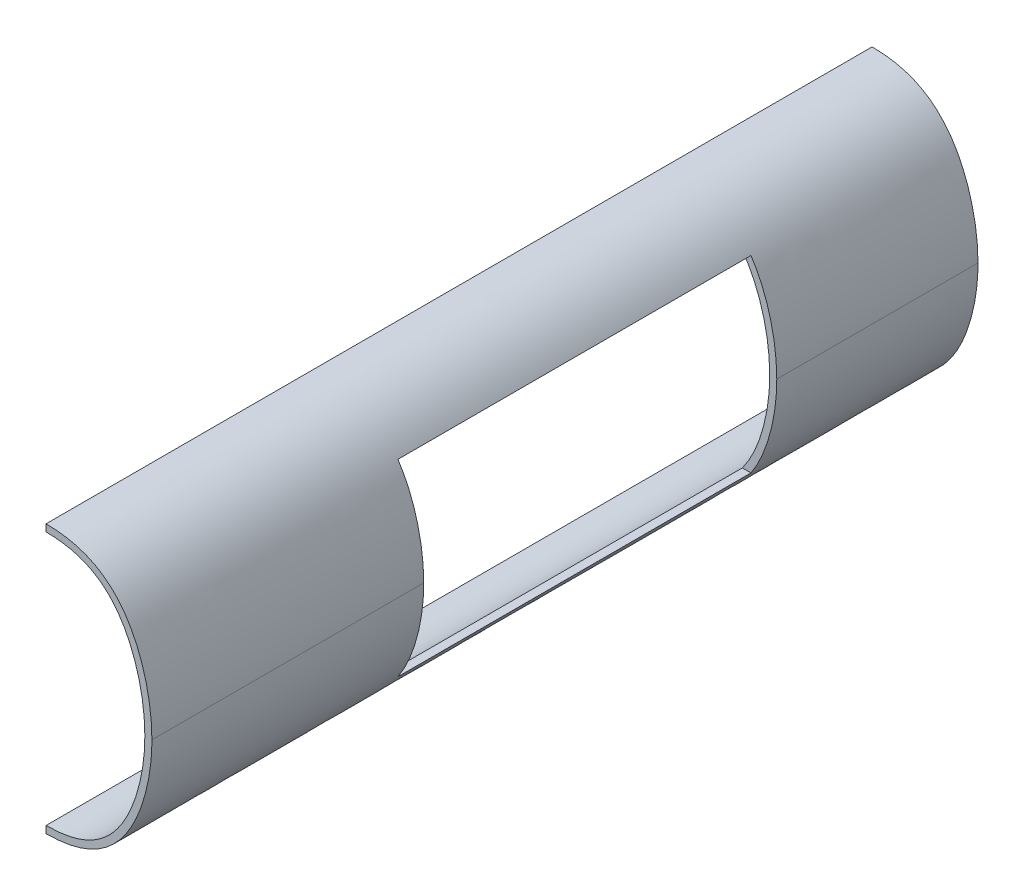
ISO-10303-21;
HEADER;
FILE_DESCRIPTION(('STEP AP214'),'2;1');
FILE_NAME('part.step','',(''),(''),'','','');
FILE_SCHEMA(('AUTOMOTIVE_DESIGN { 1 0 10303 214 1 1 1 1 }'));
ENDSEC;
DATA;
#1=APPLICATION_CONTEXT('core data for automotive mechanical design processes');
#2=APPLICATION_PROTOCOL_DEFINITION('international standard','automotive_design',2000,#1);
#3=PRODUCT_CONTEXT('',#1,'mechanical');
#4=PRODUCT('Part','Part','',(#3));
#5=PRODUCT_RELATED_PRODUCT_CATEGORY('part','',(#4));
#6=PRODUCT_DEFINITION_FORMATION('','',#4);
#7=PRODUCT_DEFINITION_CONTEXT('part definition',#1,'design');
#8=PRODUCT_DEFINITION('design','',#6,#7);
#9=PRODUCT_DEFINITION_SHAPE('','',#8);
#10=(LENGTH_UNIT() NAMED_UNIT(*) SI_UNIT(.MILLI.,.METRE.));
#11=(NAMED_UNIT(*) PLANE_ANGLE_UNIT() SI_UNIT($,.RADIAN.));
#12=(NAMED_UNIT(*) SI_UNIT($,.STERADIAN.) SOLID_ANGLE_UNIT());
#13=UNCERTAINTY_MEASURE_WITH_UNIT(LENGTH_MEASURE(1.E-05),#10,'distance_accuracy_value','');
#14=(GEOMETRIC_REPRESENTATION_CONTEXT(3) GLOBAL_UNCERTAINTY_ASSIGNED_CONTEXT((#13)) GLOBAL_UNIT_ASSIGNED_CONTEXT((#10,
#11,#12)) REPRESENTATION_CONTEXT('',''));
#15=CARTESIAN_POINT('',(0.,0.,0.));
#16=DIRECTION('',(0.,0.,1.));
#17=DIRECTION('',(1.,0.,0.));
#18=AXIS2_PLACEMENT_3D('',#15,#16,#17);
#19=CARTESIAN_POINT('',(129.417258247769,40.,-90.));
#20=DIRECTION('',(0.,0.,-1.));
#21=DIRECTION('',(0.,1.,0.));
#22=AXIS2_PLACEMENT_3D('',#19,#20,#21);
#23=PLANE('',#22);
#24=DIRECTION('',(-1.,0.,0.));
#25=VECTOR('',#24,1.);
#26=CARTESIAN_POINT('',(129.417258247769,40.,-90.));
#27=LINE('',#26,#25);
#28=CARTESIAN_POINT('',(114.03435108866,40.0000000000056,-90.));
#29=VERTEX_POINT('',#28);
#30=CARTESIAN_POINT('',(110.363044156828,40.,-90.));
#31=VERTEX_POINT('',#30);
#32=EDGE_CURVE('E163',#29,#31,#27,.T.);
#33=ORIENTED_EDGE('',*,*,#32,.T.);
#34=CARTESIAN_POINT('',(122.,0.,-90.));
#35=CARTESIAN_POINT('',(122.,3.28869583185754,-90.));
#36=CARTESIAN_POINT('',(121.792444122015,6.46128802269029,-90.));
#37=CARTESIAN_POINT('',(121.033233095635,12.6588725326172,-90.));
#38=CARTESIAN_POINT('',(120.481395371989,15.6836409951729,-90.));
#39=CARTESIAN_POINT('',(119.052306997594,21.5977641807771,-90.));
#40=CARTESIAN_POINT('',(118.174928997309,24.4868468848606,-90.));
#41=CARTESIAN_POINT('',(116.065931680565,30.0772521284996,-90.));
#42=CARTESIAN_POINT('',(114.834227827324,32.7780606729056,-90.));
#43=CARTESIAN_POINT('',(111.943828956462,37.88564685075,-90.));
#44=CARTESIAN_POINT('',(110.285874467775,40.2913945588537,-90.));
#45=CARTESIAN_POINT('',(107.387031345074,43.5765434502416,-90.));
#46=CARTESIAN_POINT('',(106.35165180192,44.6175868515967,-90.));
#47=CARTESIAN_POINT('',(104.118858714764,46.5738644087914,-90.));
#48=CARTESIAN_POINT('',(102.921509381826,47.4891856345442,-90.));
#49=CARTESIAN_POINT('',(100.332473442126,49.1744868527528,-90.));
#50=CARTESIAN_POINT('',(98.9407493786021,49.9446031817335,-90.));
#51=CARTESIAN_POINT('',(95.9213280057517,51.3146447513835,-90.));
#52=CARTESIAN_POINT('',(94.2934859206099,51.9146450933876,-90.));
#53=CARTESIAN_POINT('',(88.983824843489,53.4086746793709,-90.));
#54=CARTESIAN_POINT('',(84.874930893814,54.,-90.));
#55=CARTESIAN_POINT('',(80.,54.,-90.));
#56=B_SPLINE_CURVE_WITH_KNOTS('',3,(#34,#35,#36,#37,#38,#39,#40,#41,#42,#43,#44,#45,#46,#47,#48,
#49,#50,#51,#52,#53,#54,#55),.UNSPECIFIED.,.F.,.F.,(4,2,2,2,2,2,2,2,2,2,4),(0.,0.125,0.25,0.375,
0.5,0.625,0.6875,0.75,0.8125,0.875,1.),.UNSPECIFIED.);
#57=CARTESIAN_POINT('',(122.,0.,-90.));
#58=VERTEX_POINT('',#57);
#59=EDGE_CURVE('E144',#31,#58,#56,.F.);
#60=ORIENTED_EDGE('',*,*,#59,.T.);
#61=CARTESIAN_POINT('',(80.,-54.,-90.));
#62=CARTESIAN_POINT('',(84.8749308938141,-54.,-90.));
#63=CARTESIAN_POINT('',(88.983824843489,-53.4086746793709,-90.));
#64=CARTESIAN_POINT('',(94.2934859206099,-51.9146450933876,-90.));
#65=CARTESIAN_POINT('',(95.9213280057516,-51.3146447513835,-90.));
#66=CARTESIAN_POINT('',(98.9407493786021,-49.9446031817335,-90.));
#67=CARTESIAN_POINT('',(100.332473442126,-49.1744868527527,-90.));
#68=CARTESIAN_POINT('',(102.921509381826,-47.4891856345442,-90.));
#69=CARTESIAN_POINT('',(104.118858714764,-46.5738644087914,-90.));
#70=CARTESIAN_POINT('',(106.35165180192,-44.6175868515967,-90.));
#71=CARTESIAN_POINT('',(107.387031345074,-43.5765434502416,-90.));
#72=CARTESIAN_POINT('',(110.285874467775,-40.2913945588537,-90.));
#73=CARTESIAN_POINT('',(111.943828956462,-37.88564685075,-90.));
#74=CARTESIAN_POINT('',(114.834227827324,-32.7780606729056,-90.));
#75=CARTESIAN_POINT('',(116.065931680565,-30.0772521284996,-90.));
#76=CARTESIAN_POINT('',(118.174928997309,-24.4868468848606,-90.));
#77=CARTESIAN_POINT('',(119.052306997594,-21.5977641807771,-90.));
#78=CARTESIAN_POINT('',(120.481395371989,-15.6836409951729,-90.));
#79=CARTESIAN_POINT('',(121.033233095634,-12.6588725326172,-90.));
#80=CARTESIAN_POINT('',(121.792444122015,-6.46128802269029,-90.));
#81=CARTESIAN_POINT('',(122.,-3.28869583185754,-90.));
#82=CARTESIAN_POINT('',(122.,0.,-90.));
#83=B_SPLINE_CURVE_WITH_KNOTS('',3,(#61,#62,#63,#64,#65,#66,#67,#68,#69,#70,#71,#72,#73,#74,#75,
#76,#77,#78,#79,#80,#81,#82),.UNSPECIFIED.,.F.,.F.,(4,2,2,2,2,2,2,2,2,2,4),(0.,
0.124999999999999,0.187499999999999,0.249999999999999,0.312499999999999,0.374999999999999,0.5,
0.625,0.75,0.875,1.),.UNSPECIFIED.);
#84=CARTESIAN_POINT('',(110.363044156828,-40.,-90.));
#85=VERTEX_POINT('',#84);
#86=EDGE_CURVE('E155',#58,#85,#83,.F.);
#87=ORIENTED_EDGE('',*,*,#86,.T.);
#88=DIRECTION('',(-1.,0.,0.));
#89=VECTOR('',#88,1.);
#90=CARTESIAN_POINT('',(129.417258247769,-40.,-90.));
#91=LINE('',#90,#89);
#92=CARTESIAN_POINT('',(114.03435108866,-40.,-90.));
#93=VERTEX_POINT('',#92);
#94=EDGE_CURVE('E373',#93,#85,#91,.T.);
#95=ORIENTED_EDGE('',*,*,#94,.F.);
#96=CARTESIAN_POINT('',(80.,-57.,-90.));
#97=CARTESIAN_POINT('',(110.715171183919,-57.,-90.));
#98=CARTESIAN_POINT('',(118.023084898436,-36.9930136098683,-90.));
#99=CARTESIAN_POINT('',(125.,-20.4980083685293,-90.));
#100=CARTESIAN_POINT('',(125.,0.,-90.));
#101=B_SPLINE_CURVE_WITH_KNOTS('',4,(#96,#97,#98,#99,#100),.UNSPECIFIED.,.F.,.F.,(5,5),(0.,1.),.UNSPECIFIED.);
#102=CARTESIAN_POINT('',(125.,0.,-90.));
#103=VERTEX_POINT('',#102);
#104=EDGE_CURVE('E73',#93,#103,#101,.T.);
#105=ORIENTED_EDGE('',*,*,#104,.T.);
#106=CARTESIAN_POINT('',(125.,0.,-90.));
#107=CARTESIAN_POINT('',(125.,20.4980083685293,-90.));
#108=CARTESIAN_POINT('',(118.023084898436,36.9930136098683,-90.));
#109=CARTESIAN_POINT('',(110.715171183919,57.,-90.));
#110=CARTESIAN_POINT('',(80.,57.,-90.));
#111=B_SPLINE_CURVE_WITH_KNOTS('',4,(#106,#107,#108,#109,#110),.UNSPECIFIED.,.F.,.F.,(5,5),(0.,
1.),.UNSPECIFIED.);
#112=EDGE_CURVE('E359',#103,#29,#111,.T.);
#113=ORIENTED_EDGE('',*,*,#112,.T.);
#114=EDGE_LOOP('',(#33,#60,#87,#95,#105,#113));
#115=FACE_BOUND('',#114,.T.);
#116=ADVANCED_FACE('F43',(#115),#23,.F.);
#117=CARTESIAN_POINT('',(129.417258247769,-40.,60.));
#118=DIRECTION('',(0.,0.,1.));
#119=DIRECTION('',(0.,-1.,0.));
#120=AXIS2_PLACEMENT_3D('',#117,#118,#119);
#121=PLANE('',#120);
#122=CARTESIAN_POINT('',(80.,-54.,60.));
#123=CARTESIAN_POINT('',(84.8749308938141,-54.,60.));
#124=CARTESIAN_POINT('',(88.983824843489,-53.4086746793709,60.));
#125=CARTESIAN_POINT('',(94.2934859206099,-51.9146450933876,60.));
#126=CARTESIAN_POINT('',(95.9213280057516,-51.3146447513835,60.));
#127=CARTESIAN_POINT('',(98.9407493786021,-49.9446031817335,60.));
#128=CARTESIAN_POINT('',(100.332473442126,-49.1744868527527,60.));
#129=CARTESIAN_POINT('',(102.921509381826,-47.4891856345442,60.));
#130=CARTESIAN_POINT('',(104.118858714764,-46.5738644087914,60.));
#131=CARTESIAN_POINT('',(106.35165180192,-44.6175868515967,60.));
#132=CARTESIAN_POINT('',(107.387031345074,-43.5765434502416,60.));
#133=CARTESIAN_POINT('',(110.285874467775,-40.2913945588537,60.));
#134=CARTESIAN_POINT('',(111.943828956462,-37.88564685075,60.));
#135=CARTESIAN_POINT('',(114.834227827324,-32.7780606729056,60.));
#136=CARTESIAN_POINT('',(116.065931680565,-30.0772521284996,60.));
#137=CARTESIAN_POINT('',(118.174928997309,-24.4868468848606,60.));
#138=CARTESIAN_POINT('',(119.052306997594,-21.5977641807771,60.));
#139=CARTESIAN_POINT('',(120.481395371989,-15.6836409951729,60.));
#140=CARTESIAN_POINT('',(121.033233095634,-12.6588725326172,60.));
#141=CARTESIAN_POINT('',(121.792444122015,-6.46128802269029,60.));
#142=CARTESIAN_POINT('',(122.,-3.28869583185754,60.));
#143=CARTESIAN_POINT('',(122.,0.,60.));
#144=B_SPLINE_CURVE_WITH_KNOTS('',3,(#122,#123,#124,#125,#126,#127,#128,#129,#130,#131,#132,
#133,#134,#135,#136,#137,#138,#139,#140,#141,#142,#143),.UNSPECIFIED.,.F.,.F.,(4,2,2,2,2,2,2,2,
2,2,4),(0.,0.124999999999999,0.187499999999999,0.249999999999999,0.312499999999999,
0.374999999999999,0.5,0.625,0.75,0.875,1.),.UNSPECIFIED.);
#145=CARTESIAN_POINT('',(110.363044156828,-40.,60.));
#146=VERTEX_POINT('',#145);
#147=CARTESIAN_POINT('',(122.,0.,60.));
#148=VERTEX_POINT('',#147);
#149=EDGE_CURVE('E65',#146,#148,#144,.T.);
#150=ORIENTED_EDGE('',*,*,#149,.T.);
#151=CARTESIAN_POINT('',(122.,0.,60.));
#152=CARTESIAN_POINT('',(122.,3.28869583185754,60.));
#153=CARTESIAN_POINT('',(121.792444122015,6.46128802269029,60.));
#154=CARTESIAN_POINT('',(121.033233095635,12.6588725326172,60.));
#155=CARTESIAN_POINT('',(120.481395371989,15.6836409951729,60.));
#156=CARTESIAN_POINT('',(119.052306997594,21.5977641807771,60.));
#157=CARTESIAN_POINT('',(118.174928997309,24.4868468848606,60.));
#158=CARTESIAN_POINT('',(116.065931680565,30.0772521284996,60.));
#159=CARTESIAN_POINT('',(114.834227827324,32.7780606729056,60.));
#160=CARTESIAN_POINT('',(111.943828956462,37.88564685075,60.));
#161=CARTESIAN_POINT('',(110.285874467775,40.2913945588537,60.));
#162=CARTESIAN_POINT('',(107.387031345074,43.5765434502416,60.));
#163=CARTESIAN_POINT('',(106.35165180192,44.6175868515967,60.));
#164=CARTESIAN_POINT('',(104.118858714764,46.5738644087914,60.));
#165=CARTESIAN_POINT('',(102.921509381826,47.4891856345442,60.));
#166=CARTESIAN_POINT('',(100.332473442126,49.1744868527528,60.));
#167=CARTESIAN_POINT('',(98.9407493786021,49.9446031817335,60.));
#168=CARTESIAN_POINT('',(95.9213280057517,51.3146447513835,60.));
#169=CARTESIAN_POINT('',(94.2934859206099,51.9146450933876,60.));
#170=CARTESIAN_POINT('',(88.983824843489,53.4086746793709,60.));
#171=CARTESIAN_POINT('',(84.874930893814,54.,60.));
#172=CARTESIAN_POINT('',(80.,54.,60.));
#173=B_SPLINE_CURVE_WITH_KNOTS('',3,(#151,#152,#153,#154,#155,#156,#157,#158,#159,#160,#161,
#162,#163,#164,#165,#166,#167,#168,#169,#170,#171,#172),.UNSPECIFIED.,.F.,.F.,(4,2,2,2,2,2,2,2,
2,2,4),(0.,0.125,0.25,0.375,0.5,0.625,0.6875,0.75,0.8125,0.875,1.),.UNSPECIFIED.);
#174=CARTESIAN_POINT('',(110.363044156828,40.,60.));
#175=VERTEX_POINT('',#174);
#176=EDGE_CURVE('E166',#148,#175,#173,.T.);
#177=ORIENTED_EDGE('',*,*,#176,.T.);
#178=DIRECTION('',(-1.,0.,0.));
#179=VECTOR('',#178,1.);
#180=CARTESIAN_POINT('',(129.417258247769,40.,60.));
#181=LINE('',#180,#179);
#182=CARTESIAN_POINT('',(114.03435108866,40.,60.));
#183=VERTEX_POINT('',#182);
#184=EDGE_CURVE('E367',#183,#175,#181,.T.);
#185=ORIENTED_EDGE('',*,*,#184,.F.);
#186=CARTESIAN_POINT('',(125.,0.,60.));
#187=CARTESIAN_POINT('',(125.,20.4980083685293,60.));
#188=CARTESIAN_POINT('',(118.023084898436,36.9930136098683,60.));
#189=CARTESIAN_POINT('',(110.715171183919,57.,60.));
#190=CARTESIAN_POINT('',(80.,57.,60.));
#191=B_SPLINE_CURVE_WITH_KNOTS('',4,(#186,#187,#188,#189,#190),.UNSPECIFIED.,.F.,.F.,(5,5),(0.,
1.),.UNSPECIFIED.);
#192=CARTESIAN_POINT('',(125.,0.,60.));
#193=VERTEX_POINT('',#192);
#194=EDGE_CURVE('E396',#183,#193,#191,.F.);
#195=ORIENTED_EDGE('',*,*,#194,.T.);
#196=CARTESIAN_POINT('',(80.,-57.,60.));
#197=CARTESIAN_POINT('',(110.715171183919,-57.,60.));
#198=CARTESIAN_POINT('',(118.023084898436,-36.9930136098683,60.));
#199=CARTESIAN_POINT('',(125.,-20.4980083685293,60.));
#200=CARTESIAN_POINT('',(125.,0.,60.));
#201=B_SPLINE_CURVE_WITH_KNOTS('',4,(#196,#197,#198,#199,#200),.UNSPECIFIED.,.F.,.F.,(5,5),(0.,
1.),.UNSPECIFIED.);
#202=CARTESIAN_POINT('',(114.034351088664,-40.,60.));
#203=VERTEX_POINT('',#202);
#204=EDGE_CURVE('E374',#193,#203,#201,.F.);
#205=ORIENTED_EDGE('',*,*,#204,.T.);
#206=DIRECTION('',(-1.,0.,0.));
#207=VECTOR('',#206,1.);
#208=CARTESIAN_POINT('',(129.417258247769,-40.,60.));
#209=LINE('',#208,#207);
#210=EDGE_CURVE('E377',#203,#146,#209,.T.);
#211=ORIENTED_EDGE('',*,*,#210,.T.);
#212=EDGE_LOOP('',(#150,#177,#185,#195,#205,#211));
#213=FACE_BOUND('',#212,.T.);
#214=ADVANCED_FACE('F216',(#213),#121,.F.);
#215=CARTESIAN_POINT('',(129.417258247769,40.,60.));
#216=DIRECTION('',(0.,1.,0.));
#217=DIRECTION('',(0.,0.,1.));
#218=AXIS2_PLACEMENT_3D('',#215,#216,#217);
#219=PLANE('',#218);
#220=ORIENTED_EDGE('',*,*,#184,.T.);
#221=DIRECTION('',(0.,0.,1.));
#222=VECTOR('',#221,1.);
#223=CARTESIAN_POINT('',(110.363044156828,40.,15.7170566811359));
#224=LINE('',#223,#222);
#225=EDGE_CURVE('E160',#175,#31,#224,.F.);
#226=ORIENTED_EDGE('',*,*,#225,.T.);
#227=ORIENTED_EDGE('',*,*,#32,.F.);
#228=DIRECTION('',(0.,0.,-1.));
#229=VECTOR('',#228,1.);
#230=CARTESIAN_POINT('',(114.034351088664,40.,140.));
#231=LINE('',#230,#229);
#232=EDGE_CURVE('E401',#29,#183,#231,.F.);
#233=ORIENTED_EDGE('',*,*,#232,.T.);
#234=EDGE_LOOP('',(#220,#226,#227,#233));
#235=FACE_BOUND('',#234,.T.);
#236=ADVANCED_FACE('F273',(#235),#219,.F.);
#237=CARTESIAN_POINT('',(125.,0.,140.));
#238=CARTESIAN_POINT('',(125.,20.4980083685293,140.));
#239=CARTESIAN_POINT('',(118.023084898436,36.9930136098683,140.));
#240=CARTESIAN_POINT('',(110.715171183919,57.,140.));
#241=CARTESIAN_POINT('',(80.,57.,140.));
#242=B_SPLINE_CURVE_WITH_KNOTS('',4,(#237,#238,#239,#240,#241),.UNSPECIFIED.,.F.,.F.,(5,5),(0.,
1.),.UNSPECIFIED.);
#243=DIRECTION('',(0.,0.,-1.));
#244=VECTOR('',#243,1.);
#245=SURFACE_OF_LINEAR_EXTRUSION('',#242,#244);
#246=ORIENTED_EDGE('',*,*,#194,.F.);
#247=ORIENTED_EDGE('',*,*,#232,.F.);
#248=ORIENTED_EDGE('',*,*,#112,.F.);
#249=DIRECTION('',(0.,0.,-1.));
#250=VECTOR('',#249,1.);
#251=CARTESIAN_POINT('',(125.,0.,140.));
#252=LINE('',#251,#250);
#253=CARTESIAN_POINT('',(125.,0.,-175.5));
#254=VERTEX_POINT('',#253);
#255=EDGE_CURVE('E314',#103,#254,#252,.T.);
#256=ORIENTED_EDGE('',*,*,#255,.T.);
#257=CARTESIAN_POINT('',(125.,0.,-175.5));
#258=CARTESIAN_POINT('',(125.,20.4980083685293,-175.5));
#259=CARTESIAN_POINT('',(118.023084898436,36.9930136098683,-175.5));
#260=CARTESIAN_POINT('',(110.715171183919,57.,-175.5));
#261=CARTESIAN_POINT('',(80.,57.,-175.5));
#262=B_SPLINE_CURVE_WITH_KNOTS('',4,(#257,#258,#259,#260,#261),.UNSPECIFIED.,.F.,.F.,(5,5),(0.,
1.),.UNSPECIFIED.);
#263=CARTESIAN_POINT('',(80.,57.,-175.5));
#264=VERTEX_POINT('',#263);
#265=EDGE_CURVE('E248',#254,#264,#262,.T.);
#266=ORIENTED_EDGE('',*,*,#265,.T.);
#267=DIRECTION('',(0.,0.,-1.));
#268=VECTOR('',#267,1.);
#269=CARTESIAN_POINT('',(80.,57.,140.));
#270=LINE('',#269,#268);
#271=CARTESIAN_POINT('',(80.,57.,175.5));
#272=VERTEX_POINT('',#271);
#273=EDGE_CURVE('E315',#272,#264,#270,.T.);
#274=ORIENTED_EDGE('',*,*,#273,.F.);
#275=CARTESIAN_POINT('',(125.,0.,175.5));
#276=CARTESIAN_POINT('',(125.000021905957,0.88412495725523,175.5));
#277=CARTESIAN_POINT('',(124.985396659929,1.76823988011449,175.5));
#278=CARTESIAN_POINT('',(124.927153725745,3.53610800996547,175.5));
#279=CARTESIAN_POINT('',(124.883516647795,4.4198605792527,175.5));
#280=CARTESIAN_POINT('',(124.767521915685,6.18594603403943,175.5));
#281=CARTESIAN_POINT('',(124.695149010556,7.06827791546259,175.5));
#282=CARTESIAN_POINT('',(124.522051194296,8.83047930563684,175.5));
#283=CARTESIAN_POINT('',(124.421315919242,9.71034779531907,175.5));
#284=CARTESIAN_POINT('',(124.191840615575,11.4665774637001,175.5));
#285=CARTESIAN_POINT('',(124.063095742492,12.3429380089378,175.5));
#286=CARTESIAN_POINT('',(123.775801017414,14.1037238194357,175.5));
#287=CARTESIAN_POINT('',(123.616848556384,14.9880834195816,175.5));
#288=CARTESIAN_POINT('',(123.270463816436,16.751116940104,175.5));
#289=CARTESIAN_POINT('',(123.083034405673,17.6297914237947,175.5));
#290=CARTESIAN_POINT('',(122.679522563988,19.3803445072033,175.5));
#291=CARTESIAN_POINT('',(122.463446322599,20.2522245319912,175.5));
#292=CARTESIAN_POINT('',(122.00215504294,21.987995860548,175.5));
#293=CARTESIAN_POINT('',(121.756947939606,22.8518892709965,175.5));
#294=CARTESIAN_POINT('',(121.236532873307,24.5704252174842,175.5));
#295=CARTESIAN_POINT('',(120.961331218873,25.4250696573818,175.5));
#296=CARTESIAN_POINT('',(120.452294707547,26.9115349975291,175.5));
#297=CARTESIAN_POINT('',(120.225292345231,27.5457015435355,175.5));
#298=CARTESIAN_POINT('',(119.75305317457,28.8071229521,175.5));
#299=CARTESIAN_POINT('',(119.507818943831,29.4343787773469,175.5));
#300=CARTESIAN_POINT('',(118.998344975042,30.6810854913774,175.5));
#301=CARTESIAN_POINT('',(118.734106516961,31.3005369025057,175.5));
#302=CARTESIAN_POINT('',(118.185702609543,32.5306910474586,175.5));
#303=CARTESIAN_POINT('',(117.90153395468,33.1413923548264,175.5));
#304=CARTESIAN_POINT('',(117.313229846686,34.3509068045039,175.5));
#305=CARTESIAN_POINT('',(117.009155341077,34.9497495383415,175.5));
#306=CARTESIAN_POINT('',(116.379291347667,36.1359809229719,175.5));
#307=CARTESIAN_POINT('',(116.053500317411,36.7233687563222,175.5));
#308=CARTESIAN_POINT('',(115.379279480129,37.8849016102102,175.5));
#309=CARTESIAN_POINT('',(115.030853438759,38.4590488120903,175.5));
#310=CARTESIAN_POINT('',(114.310390053749,39.592277664032,175.5));
#311=CARTESIAN_POINT('',(113.938355131017,40.1513608504427,175.5));
#312=CARTESIAN_POINT('',(113.152408320626,41.2773294961636,175.5));
#313=CARTESIAN_POINT('',(112.737363906449,41.843426579539,175.5));
#314=CARTESIAN_POINT('',(111.879742484711,42.9543338139712,175.5));
#315=CARTESIAN_POINT('',(111.437167777736,43.4991457375584,175.5));
#316=CARTESIAN_POINT('',(110.523973904608,44.5647633733149,175.5));
#317=CARTESIAN_POINT('',(110.053355404172,45.0855696548222,175.5));
#318=CARTESIAN_POINT('',(109.085326142833,46.0989354165096,175.5));
#319=CARTESIAN_POINT('',(108.587993544078,46.5915694344624,175.5));
#320=CARTESIAN_POINT('',(107.565710958554,47.5474009012903,175.5));
#321=CARTESIAN_POINT('',(107.040759429389,48.0105967029718,175.5));
#322=CARTESIAN_POINT('',(105.964228354557,48.9049063431717,175.5));
#323=CARTESIAN_POINT('',(105.412650317002,49.3360219951859,175.5));
#324=CARTESIAN_POINT('',(104.282182238455,50.1655236867964,175.5));
#325=CARTESIAN_POINT('',(103.703196878404,50.5637799093767,175.5));
#326=CARTESIAN_POINT('',(102.521808687751,51.3239994677627,175.5));
#327=CARTESIAN_POINT('',(101.919404113041,51.6859600932992,175.5));
#328=CARTESIAN_POINT('',(100.693643642394,52.3723857826608,175.5));
#329=CARTESIAN_POINT('',(100.070288609451,52.6968523885042,175.5));
#330=CARTESIAN_POINT('',(98.8019766290414,53.3094060214475,175.5));
#331=CARTESIAN_POINT('',(98.1569242861535,53.597295308866,175.5));
#332=CARTESIAN_POINT('',(96.8511130820279,54.1348887912943,175.5));
#333=CARTESIAN_POINT('',(96.1903537615974,54.3845918683417,175.5));
#334=CARTESIAN_POINT('',(94.8559749373416,54.846554996168,175.5));
#335=CARTESIAN_POINT('',(94.1823568108767,55.058819032534,175.5));
#336=CARTESIAN_POINT('',(92.9536295290234,55.4103525432984,175.5));
#337=CARTESIAN_POINT('',(92.4002811862601,55.5558304738694,175.5));
#338=CARTESIAN_POINT('',(91.2880661692533,55.8239223329893,175.5));
#339=CARTESIAN_POINT('',(90.7291993775877,55.946535773916,175.5));
#340=CARTESIAN_POINT('',(89.6069509337732,56.1698908286375,175.5));
#341=CARTESIAN_POINT('',(89.0435679360075,56.2706256518717,175.5));
#342=CARTESIAN_POINT('',(87.9132782562355,56.4512502477082,175.5));
#343=CARTESIAN_POINT('',(87.3463703902539,56.5311325803773,175.5));
#344=CARTESIAN_POINT('',(86.2157673562683,56.6703915443754,175.5));
#345=CARTESIAN_POINT('',(85.6520961329945,56.7299637956756,175.5));
#346=CARTESIAN_POINT('',(84.5232507890276,56.8307354886724,175.5));
#347=CARTESIAN_POINT('',(83.9580770303026,56.8719390118989,175.5));
#348=CARTESIAN_POINT('',(82.8272014732656,56.9370145697491,175.5));
#349=CARTESIAN_POINT('',(82.2615004601285,56.9609004556315,175.5));
#350=CARTESIAN_POINT('',(81.1305219729804,56.9923769822036,175.5));
#351=CARTESIAN_POINT('',(80.5652452110013,56.9999929376814,175.5));
#352=CARTESIAN_POINT('',(80.,57.,175.5));
#353=B_SPLINE_CURVE_WITH_KNOTS('',3,(#275,#276,#277,#278,#279,#280,#281,#282,#283,#284,#285,
#286,#287,#288,#289,#290,#291,#292,#293,#294,#295,#296,#297,#298,#299,#300,#301,#302,#303,#304,
#305,#306,#307,#308,#309,#310,#311,#312,#313,#314,#315,#316,#317,#318,#319,#320,#321,#322,#323,
#324,#325,#326,#327,#328,#329,#330,#331,#332,#333,#334,#335,#336,#337,#338,#339,#340,#341,#342,
#343,#344,#345,#346,#347,#348,#349,#350,#351,#352),.UNSPECIFIED.,.F.,.F.,(4,2,2,2,2,2,2,2,2,2,2,
2,2,2,2,2,2,2,2,2,2,2,2,2,2,2,2,2,2,2,2,2,2,2,2,2,2,2,4),(0.,2.65223864943779,5.30625168296547,
7.96167516823353,10.6180702367655,13.2749251143878,15.9700502958243,18.6649042082795,
21.359176807443,24.0527171909762,26.7456921514531,28.7661489704064,30.7863206801265,
32.8063564549349,34.8267178760649,36.8411591485508,38.8557436530273,40.8699938566751,
42.8840378473356,44.9890604975232,47.0939074758028,49.1987045080554,51.2976471603932,
53.3967071543018,55.4956483977422,57.6025200888406,59.709548987548,61.8164911995212,
63.9343785022772,66.0523277977112,68.1700514897977,69.886026281633,71.6020376652233,
73.3185808959264,75.0357357353617,76.7358505589301,78.4355874285956,80.1339632842798,
81.8296946644076),.UNSPECIFIED.);
#354=CARTESIAN_POINT('',(125.,0.,175.5));
#355=VERTEX_POINT('',#354);
#356=EDGE_CURVE('E318',#355,#272,#353,.T.);
#357=ORIENTED_EDGE('',*,*,#356,.F.);
#358=EDGE_CURVE('E57',#355,#193,#252,.T.);
#359=ORIENTED_EDGE('',*,*,#358,.T.);
#360=EDGE_LOOP('',(#246,#247,#248,#256,#266,#274,#357,#359));
#361=FACE_BOUND('',#360,.T.);
#362=ADVANCED_FACE('F329',(#361),#245,.F.);
#363=CARTESIAN_POINT('',(80.,-57.,140.));
#364=CARTESIAN_POINT('',(110.715171183919,-57.,140.));
#365=CARTESIAN_POINT('',(118.023084898436,-36.9930136098683,140.));
#366=CARTESIAN_POINT('',(125.,-20.4980083685293,140.));
#367=CARTESIAN_POINT('',(125.,0.,140.));
#368=B_SPLINE_CURVE_WITH_KNOTS('',4,(#363,#364,#365,#366,#367),.UNSPECIFIED.,.F.,.F.,(5,5),(0.,
1.),.UNSPECIFIED.);
#369=DIRECTION('',(0.,0.,-1.));
#370=VECTOR('',#369,1.);
#371=SURFACE_OF_LINEAR_EXTRUSION('',#368,#370);
#372=DIRECTION('',(0.,0.,-1.));
#373=VECTOR('',#372,1.);
#374=CARTESIAN_POINT('',(114.034351088664,-40.,140.));
#375=LINE('',#374,#373);
#376=EDGE_CURVE('E389',#203,#93,#375,.T.);
#377=ORIENTED_EDGE('',*,*,#376,.F.);
#378=ORIENTED_EDGE('',*,*,#204,.F.);
#379=ORIENTED_EDGE('',*,*,#358,.F.);
#380=CARTESIAN_POINT('',(80.,-57.,175.5));
#381=CARTESIAN_POINT('',(80.5755602355101,-56.999992440315,175.5));
#382=CARTESIAN_POINT('',(81.1511544604504,-56.9920962045595,175.5));
#383=CARTESIAN_POINT('',(82.3027707163957,-56.9594414887975,175.5));
#384=CARTESIAN_POINT('',(82.8787919832119,-56.934656347354,175.5));
#385=CARTESIAN_POINT('',(84.0302589728295,-56.8671051108776,175.5));
#386=CARTESIAN_POINT('',(84.6057038630692,-56.824324605364,175.5));
#387=CARTESIAN_POINT('',(85.7549886351698,-56.7196621923181,175.5));
#388=CARTESIAN_POINT('',(86.3288281507797,-56.6577762359066,175.5));
#389=CARTESIAN_POINT('',(87.4802380038372,-56.5130016340427,175.5));
#390=CARTESIAN_POINT('',(88.0577805895753,-56.429890876115,175.5));
#391=CARTESIAN_POINT('',(89.2091189838251,-56.2418997181837,175.5));
#392=CARTESIAN_POINT('',(89.7829160398802,-56.1370269929438,175.5));
#393=CARTESIAN_POINT('',(90.9257124340834,-55.9044297264416,175.5));
#394=CARTESIAN_POINT('',(91.4947130517793,-55.7767114956028,175.5));
#395=CARTESIAN_POINT('',(92.6268724159215,-55.4973844391691,175.5));
#396=CARTESIAN_POINT('',(93.1900308194494,-55.3457742195572,175.5));
#397=CARTESIAN_POINT('',(94.3152646118441,-55.0159810576199,175.5));
#398=CARTESIAN_POINT('',(94.8772599128702,-54.8375241041102,175.5));
#399=CARTESIAN_POINT('',(95.992443305179,-54.4545267205077,175.5));
#400=CARTESIAN_POINT('',(96.5456294874765,-54.2499807210203,175.5));
#401=CARTESIAN_POINT('',(97.6414570879943,-53.8143491685895,175.5));
#402=CARTESIAN_POINT('',(98.1840986806204,-53.5832640550364,175.5));
#403=CARTESIAN_POINT('',(99.2571970426202,-53.0943497725944,175.5));
#404=CARTESIAN_POINT('',(99.7876540681582,-52.8365211665816,175.5));
#405=CARTESIAN_POINT('',(100.831565837115,-52.2958913464075,175.5));
#406=CARTESIAN_POINT('',(101.345104974294,-52.0132531780993,175.5));
#407=CARTESIAN_POINT('',(102.357111558487,-51.4220722581378,175.5));
#408=CARTESIAN_POINT('',(102.855577764427,-51.1135273812359,175.5));
#409=CARTESIAN_POINT('',(103.836017298633,-50.4713228034252,175.5));
#410=CARTESIAN_POINT('',(104.317991526241,-50.1376644751904,175.5));
#411=CARTESIAN_POINT('',(105.264238544751,-49.4463240706627,175.5));
#412=CARTESIAN_POINT('',(105.72851502134,-49.088647039767,175.5));
#413=CARTESIAN_POINT('',(106.570830890492,-48.405442295238,175.5));
#414=CARTESIAN_POINT('',(106.951421695139,-48.0830515584701,175.5));
#415=CARTESIAN_POINT('',(107.698834237263,-47.422628466892,175.5));
#416=CARTESIAN_POINT('',(108.065654841856,-47.0845948302158,175.5));
#417=CARTESIAN_POINT('',(108.785145416746,-46.3939542863389,175.5));
#418=CARTESIAN_POINT('',(109.137818574512,-46.041350698557,175.5));
#419=CARTESIAN_POINT('',(109.828992356071,-45.3224959956747,175.5));
#420=CARTESIAN_POINT('',(110.167491684014,-44.9562436384882,175.5));
#421=CARTESIAN_POINT('',(111.163493457125,-43.8365054639208,175.5));
#422=CARTESIAN_POINT('',(111.799618712152,-43.0638537545772,175.5));
#423=CARTESIAN_POINT('',(113.01594369353,-41.4758191722722,175.5));
#424=CARTESIAN_POINT('',(113.596134404426,-40.6604294434389,175.5));
#425=CARTESIAN_POINT('',(114.594082419832,-39.1583342016911,175.5));
#426=CARTESIAN_POINT('',(115.02133223914,-38.4778939448455,175.5));
#427=CARTESIAN_POINT('',(115.8431188209,-37.097263745601,175.5));
#428=CARTESIAN_POINT('',(116.23764461636,-36.3970672867084,175.5));
#429=CARTESIAN_POINT('',(116.995666255407,-34.9797774441466,175.5));
#430=CARTESIAN_POINT('',(117.359150034975,-34.2626776281448,175.5));
#431=CARTESIAN_POINT('',(118.056605509507,-32.8143113923982,175.5));
#432=CARTESIAN_POINT('',(118.390577504304,-32.0830451166729,175.5));
#433=CARTESIAN_POINT('',(119.031778307436,-30.6056782819398,175.5));
#434=CARTESIAN_POINT('',(119.338903111505,-29.8595326917541,175.5));
#435=CARTESIAN_POINT('',(119.926338735485,-28.3570481599689,175.5));
#436=CARTESIAN_POINT('',(120.206657800211,-27.6007124348025,175.5));
#437=CARTESIAN_POINT('',(120.741782209611,-26.0791101096768,175.5));
#438=CARTESIAN_POINT('',(120.996588273017,-25.3138437619819,175.5));
#439=CARTESIAN_POINT('',(121.481679303024,-23.7755324529587,175.5));
#440=CARTESIAN_POINT('',(121.711962614388,-23.0024869704038,175.5));
#441=CARTESIAN_POINT('',(122.134842345478,-21.4990219163246,175.5));
#442=CARTESIAN_POINT('',(122.328903418374,-20.7690133404529,175.5));
#443=CARTESIAN_POINT('',(122.69655503518,-19.3038377482415,175.5));
#444=CARTESIAN_POINT('',(122.870144931548,-18.5686705695045,175.5));
#445=CARTESIAN_POINT('',(123.197097946696,-17.09381694963,175.5));
#446=CARTESIAN_POINT('',(123.350460058286,-16.354130285374,175.5));
#447=CARTESIAN_POINT('',(123.637043950677,-14.8708420805634,175.5));
#448=CARTESIAN_POINT('',(123.770265083349,-14.1272404148222,175.5));
#449=CARTESIAN_POINT('',(124.016524874472,-12.6367009586727,175.5));
#450=CARTESIAN_POINT('',(124.129563496203,-11.8897631621973,175.5));
#451=CARTESIAN_POINT('',(124.333935211382,-10.4031704727705,175.5));
#452=CARTESIAN_POINT('',(124.425540074519,-9.6635529395536,175.5));
#453=CARTESIAN_POINT('',(124.588771333516,-8.18214966423865,175.5));
#454=CARTESIAN_POINT('',(124.66039865963,-7.44036402472445,175.5));
#455=CARTESIAN_POINT('',(124.783446333957,-5.95517473660012,175.5));
#456=CARTESIAN_POINT('',(124.834868240537,-5.21177121721964,175.5));
#457=CARTESIAN_POINT('',(124.917276623345,-3.72389602543719,175.5));
#458=CARTESIAN_POINT('',(124.948264903992,-2.97942445317111,175.5));
#459=CARTESIAN_POINT('',(124.98963175673,-1.48997015018992,175.5));
#460=CARTESIAN_POINT('',(125.000012000912,-0.744987465852309,175.5));
#461=CARTESIAN_POINT('',(125.,0.,175.5));
#462=B_SPLINE_CURVE_WITH_KNOTS('',3,(#380,#381,#382,#383,#384,#385,#386,#387,#388,#389,#390,
#391,#392,#393,#394,#395,#396,#397,#398,#399,#400,#401,#402,#403,#404,#405,#406,#407,#408,#409,
#410,#411,#412,#413,#414,#415,#416,#417,#418,#419,#420,#421,#422,#423,#424,#425,#426,#427,#428,
#429,#430,#431,#432,#433,#434,#435,#436,#437,#438,#439,#440,#441,#442,#443,#444,#445,#446,#447,
#448,#449,#450,#451,#452,#453,#454,#455,#456,#457,#458,#459,#460,#461),.UNSPECIFIED.,.F.,.F.,(4,
2,2,2,2,2,2,2,2,2,2,2,2,2,2,2,2,2,2,2,2,2,2,2,2,2,2,2,2,2,2,2,2,2,2,2,2,2,2,2,4),(0.,
1.72667724663164,3.45608662262622,5.18688353417695,6.91804749300693,8.66812834150694,
10.4175930371303,12.1665752368644,13.9156595216186,15.683987954056,17.4526945166178,
19.2213718001066,20.9900118654093,22.7477928575966,24.5057181899296,26.2635475056501,
28.0210087177988,29.5169286982239,31.0129714804452,32.5086752839095,34.0045155356669,
37.004016817017,40.0040007485445,42.4134307435608,44.8236649894484,47.2348317145728,
49.6459739400854,52.0660771977577,54.4854336782375,56.9047219834766,59.3241734825274,
61.5899624484026,63.8558230661771,66.1217964639403,68.3878427643045,70.6538931873688,
72.8894313194716,75.1248653362387,77.3601269085542,79.5951910667702,81.8300738693715),.UNSPECIFIED.);
#463=CARTESIAN_POINT('',(80.,-57.,175.5));
#464=VERTEX_POINT('',#463);
#465=EDGE_CURVE('E247',#464,#355,#462,.T.);
#466=ORIENTED_EDGE('',*,*,#465,.F.);
#467=DIRECTION('',(0.,0.,-1.));
#468=VECTOR('',#467,1.);
#469=CARTESIAN_POINT('',(80.,-57.,140.));
#470=LINE('',#469,#468);
#471=CARTESIAN_POINT('',(80.,-57.,-175.5));
#472=VERTEX_POINT('',#471);
#473=EDGE_CURVE('E11',#464,#472,#470,.T.);
#474=ORIENTED_EDGE('',*,*,#473,.T.);
#475=CARTESIAN_POINT('',(80.,-57.,-175.5));
#476=CARTESIAN_POINT('',(110.715171183919,-57.,-175.5));
#477=CARTESIAN_POINT('',(118.023084898436,-36.9930136098683,-175.5));
#478=CARTESIAN_POINT('',(125.,-20.4980083685293,-175.5));
#479=CARTESIAN_POINT('',(125.,0.,-175.5));
#480=B_SPLINE_CURVE_WITH_KNOTS('',4,(#475,#476,#477,#478,#479),.UNSPECIFIED.,.F.,.F.,(5,5),(0.,
1.),.UNSPECIFIED.);
#481=EDGE_CURVE('E240',#472,#254,#480,.T.);
#482=ORIENTED_EDGE('',*,*,#481,.T.);
#483=ORIENTED_EDGE('',*,*,#255,.F.);
#484=ORIENTED_EDGE('',*,*,#104,.F.);
#485=EDGE_LOOP('',(#377,#378,#379,#466,#474,#482,#483,#484));
#486=FACE_BOUND('',#485,.T.);
#487=ADVANCED_FACE('F45',(#486),#371,.F.);
#488=CARTESIAN_POINT('',(115.999949632893,-36.809382195833,175.5));
#489=DIRECTION('',(0.,0.,-1.));
#490=DIRECTION('',(-1.,0.,0.));
#491=AXIS2_PLACEMENT_3D('',#488,#489,#490);
#492=PLANE('',#491);
#493=CARTESIAN_POINT('',(80.,-54.,175.5));
#494=CARTESIAN_POINT('',(84.8749308938141,-54.,175.5));
#495=CARTESIAN_POINT('',(88.983824843489,-53.4086746793709,175.5));
#496=CARTESIAN_POINT('',(94.2934859206099,-51.9146450933876,175.5));
#497=CARTESIAN_POINT('',(95.9213280057516,-51.3146447513835,175.5));
#498=CARTESIAN_POINT('',(98.9407493786021,-49.9446031817335,175.5));
#499=CARTESIAN_POINT('',(100.332473442126,-49.1744868527527,175.5));
#500=CARTESIAN_POINT('',(102.921509381826,-47.4891856345442,175.5));
#501=CARTESIAN_POINT('',(104.118858714764,-46.5738644087914,175.5));
#502=CARTESIAN_POINT('',(106.35165180192,-44.6175868515967,175.5));
#503=CARTESIAN_POINT('',(107.387031345074,-43.5765434502416,175.5));
#504=CARTESIAN_POINT('',(110.285874467775,-40.2913945588537,175.5));
#505=CARTESIAN_POINT('',(111.943828956462,-37.88564685075,175.5));
#506=CARTESIAN_POINT('',(114.834227827324,-32.7780606729056,175.5));
#507=CARTESIAN_POINT('',(116.065931680565,-30.0772521284996,175.5));
#508=CARTESIAN_POINT('',(118.174928997309,-24.4868468848606,175.5));
#509=CARTESIAN_POINT('',(119.052306997594,-21.5977641807771,175.5));
#510=CARTESIAN_POINT('',(120.481395371989,-15.6836409951729,175.5));
#511=CARTESIAN_POINT('',(121.033233095634,-12.6588725326172,175.5));
#512=CARTESIAN_POINT('',(121.792444122015,-6.46128802269029,175.5));
#513=CARTESIAN_POINT('',(122.,-3.28869583185754,175.5));
#514=CARTESIAN_POINT('',(122.,0.,175.5));
#515=B_SPLINE_CURVE_WITH_KNOTS('',3,(#493,#494,#495,#496,#497,#498,#499,#500,#501,#502,#503,
#504,#505,#506,#507,#508,#509,#510,#511,#512,#513,#514),.UNSPECIFIED.,.F.,.F.,(4,2,2,2,2,2,2,2,
2,2,4),(0.,0.124999999999999,0.187499999999999,0.249999999999999,0.312499999999999,
0.374999999999999,0.5,0.625,0.75,0.875,1.),.UNSPECIFIED.);
#516=CARTESIAN_POINT('',(80.,-54.,175.5));
#517=VERTEX_POINT('',#516);
#518=CARTESIAN_POINT('',(122.,0.,175.5));
#519=VERTEX_POINT('',#518);
#520=EDGE_CURVE('E151',#517,#519,#515,.T.);
#521=ORIENTED_EDGE('',*,*,#520,.F.);
#522=DIRECTION('',(0.,1.,0.));
#523=VECTOR('',#522,1.);
#524=CARTESIAN_POINT('',(80.,-57.,175.5));
#525=LINE('',#524,#523);
#526=EDGE_CURVE('E165',#464,#517,#525,.T.);
#527=ORIENTED_EDGE('',*,*,#526,.F.);
#528=ORIENTED_EDGE('',*,*,#465,.T.);
#529=ORIENTED_EDGE('',*,*,#356,.T.);
#530=DIRECTION('',(0.,1.,0.));
#531=VECTOR('',#530,1.);
#532=CARTESIAN_POINT('',(80.,54.,175.5));
#533=LINE('',#532,#531);
#534=CARTESIAN_POINT('',(80.,54.,175.5));
#535=VERTEX_POINT('',#534);
#536=EDGE_CURVE('E187',#535,#272,#533,.T.);
#537=ORIENTED_EDGE('',*,*,#536,.F.);
#538=CARTESIAN_POINT('',(122.,0.,175.5));
#539=CARTESIAN_POINT('',(122.,3.28869583185754,175.5));
#540=CARTESIAN_POINT('',(121.792444122015,6.46128802269029,175.5));
#541=CARTESIAN_POINT('',(121.033233095635,12.6588725326172,175.5));
#542=CARTESIAN_POINT('',(120.481395371989,15.6836409951729,175.5));
#543=CARTESIAN_POINT('',(119.052306997594,21.5977641807771,175.5));
#544=CARTESIAN_POINT('',(118.174928997309,24.4868468848606,175.5));
#545=CARTESIAN_POINT('',(116.065931680565,30.0772521284996,175.5));
#546=CARTESIAN_POINT('',(114.834227827324,32.7780606729056,175.5));
#547=CARTESIAN_POINT('',(111.943828956462,37.88564685075,175.5));
#548=CARTESIAN_POINT('',(110.285874467775,40.2913945588537,175.5));
#549=CARTESIAN_POINT('',(107.387031345074,43.5765434502416,175.5));
#550=CARTESIAN_POINT('',(106.35165180192,44.6175868515967,175.5));
#551=CARTESIAN_POINT('',(104.118858714764,46.5738644087914,175.5));
#552=CARTESIAN_POINT('',(102.921509381826,47.4891856345442,175.5));
#553=CARTESIAN_POINT('',(100.332473442126,49.1744868527528,175.5));
#554=CARTESIAN_POINT('',(98.9407493786021,49.9446031817335,175.5));
#555=CARTESIAN_POINT('',(95.9213280057517,51.3146447513835,175.5));
#556=CARTESIAN_POINT('',(94.2934859206099,51.9146450933876,175.5));
#557=CARTESIAN_POINT('',(88.983824843489,53.4086746793709,175.5));
#558=CARTESIAN_POINT('',(84.874930893814,54.,175.5));
#559=CARTESIAN_POINT('',(80.,54.,175.5));
#560=B_SPLINE_CURVE_WITH_KNOTS('',3,(#538,#539,#540,#541,#542,#543,#544,#545,#546,#547,#548,
#549,#550,#551,#552,#553,#554,#555,#556,#557,#558,#559),.UNSPECIFIED.,.F.,.F.,(4,2,2,2,2,2,2,2,
2,2,4),(0.,0.125,0.25,0.375,0.5,0.625,0.6875,0.75,0.8125,0.875,1.),.UNSPECIFIED.);
#561=EDGE_CURVE('E299',#519,#535,#560,.T.);
#562=ORIENTED_EDGE('',*,*,#561,.F.);
#563=EDGE_LOOP('',(#521,#527,#528,#529,#537,#562));
#564=FACE_BOUND('',#563,.T.);
#565=ADVANCED_FACE('F271',(#564),#492,.F.);
#566=CARTESIAN_POINT('',(115.999949632893,-36.809382195833,-175.5));
#567=DIRECTION('',(0.,0.,1.));
#568=DIRECTION('',(-1.,0.,0.));
#569=AXIS2_PLACEMENT_3D('',#566,#567,#568);
#570=PLANE('',#569);
#571=ORIENTED_EDGE('',*,*,#481,.F.);
#572=DIRECTION('',(0.,1.,0.));
#573=VECTOR('',#572,1.);
#574=CARTESIAN_POINT('',(80.,-36.809382195833,-175.5));
#575=LINE('',#574,#573);
#576=CARTESIAN_POINT('',(80.,-54.,-175.5));
#577=VERTEX_POINT('',#576);
#578=EDGE_CURVE('E171',#472,#577,#575,.T.);
#579=ORIENTED_EDGE('',*,*,#578,.T.);
#580=CARTESIAN_POINT('',(122.,0.,-175.5));
#581=CARTESIAN_POINT('',(122.,-3.28869583185754,-175.5));
#582=CARTESIAN_POINT('',(121.792444122015,-6.46128802269029,-175.5));
#583=CARTESIAN_POINT('',(121.033233095634,-12.6588725326172,-175.5));
#584=CARTESIAN_POINT('',(120.481395371989,-15.6836409951729,-175.5));
#585=CARTESIAN_POINT('',(119.052306997594,-21.5977641807771,-175.5));
#586=CARTESIAN_POINT('',(118.174928997309,-24.4868468848606,-175.5));
#587=CARTESIAN_POINT('',(116.065931680565,-30.0772521284996,-175.5));
#588=CARTESIAN_POINT('',(114.834227827324,-32.7780606729056,-175.5));
#589=CARTESIAN_POINT('',(111.943828956462,-37.88564685075,-175.5));
#590=CARTESIAN_POINT('',(110.285874467775,-40.2913945588537,-175.5));
#591=CARTESIAN_POINT('',(107.387031345074,-43.5765434502416,-175.5));
#592=CARTESIAN_POINT('',(106.35165180192,-44.6175868515967,-175.5));
#593=CARTESIAN_POINT('',(104.118858714764,-46.5738644087914,-175.5));
#594=CARTESIAN_POINT('',(102.921509381826,-47.4891856345442,-175.5));
#595=CARTESIAN_POINT('',(100.332473442126,-49.1744868527527,-175.5));
#596=CARTESIAN_POINT('',(98.9407493786021,-49.9446031817335,-175.5));
#597=CARTESIAN_POINT('',(95.9213280057516,-51.3146447513835,-175.5));
#598=CARTESIAN_POINT('',(94.2934859206099,-51.9146450933876,-175.5));
#599=CARTESIAN_POINT('',(88.983824843489,-53.4086746793709,-175.5));
#600=CARTESIAN_POINT('',(84.8749308938141,-54.,-175.5));
#601=CARTESIAN_POINT('',(80.,-54.,-175.5));
#602=B_SPLINE_CURVE_WITH_KNOTS('',3,(#580,#581,#582,#583,#584,#585,#586,#587,#588,#589,#590,
#591,#592,#593,#594,#595,#596,#597,#598,#599,#600,#601),.UNSPECIFIED.,.F.,.F.,(4,2,2,2,2,2,2,2,
2,2,4),(0.,0.125,0.25,0.375,0.5,0.625000000000001,0.687500000000001,0.750000000000001,
0.812500000000001,0.875000000000001,1.),.UNSPECIFIED.);
#603=CARTESIAN_POINT('',(122.,0.,-175.5));
#604=VERTEX_POINT('',#603);
#605=EDGE_CURVE('E152',#604,#577,#602,.T.);
#606=ORIENTED_EDGE('',*,*,#605,.F.);
#607=CARTESIAN_POINT('',(80.,54.,-175.5));
#608=CARTESIAN_POINT('',(84.874930893814,54.,-175.5));
#609=CARTESIAN_POINT('',(88.983824843489,53.4086746793709,-175.5));
#610=CARTESIAN_POINT('',(94.2934859206099,51.9146450933876,-175.5));
#611=CARTESIAN_POINT('',(95.9213280057517,51.3146447513835,-175.5));
#612=CARTESIAN_POINT('',(98.9407493786021,49.9446031817335,-175.5));
#613=CARTESIAN_POINT('',(100.332473442126,49.1744868527528,-175.5));
#614=CARTESIAN_POINT('',(102.921509381826,47.4891856345442,-175.5));
#615=CARTESIAN_POINT('',(104.118858714764,46.5738644087914,-175.5));
#616=CARTESIAN_POINT('',(106.35165180192,44.6175868515967,-175.5));
#617=CARTESIAN_POINT('',(107.387031345074,43.5765434502416,-175.5));
#618=CARTESIAN_POINT('',(110.285874467775,40.2913945588537,-175.5));
#619=CARTESIAN_POINT('',(111.943828956462,37.88564685075,-175.5));
#620=CARTESIAN_POINT('',(114.834227827324,32.7780606729056,-175.5));
#621=CARTESIAN_POINT('',(116.065931680565,30.0772521284996,-175.5));
#622=CARTESIAN_POINT('',(118.174928997309,24.4868468848606,-175.5));
#623=CARTESIAN_POINT('',(119.052306997594,21.5977641807771,-175.5));
#624=CARTESIAN_POINT('',(120.481395371989,15.6836409951729,-175.5));
#625=CARTESIAN_POINT('',(121.033233095635,12.6588725326172,-175.5));
#626=CARTESIAN_POINT('',(121.792444122015,6.46128802269029,-175.5));
#627=CARTESIAN_POINT('',(122.,3.28869583185754,-175.5));
#628=CARTESIAN_POINT('',(122.,0.,-175.5));
#629=B_SPLINE_CURVE_WITH_KNOTS('',3,(#607,#608,#609,#610,#611,#612,#613,#614,#615,#616,#617,
#618,#619,#620,#621,#622,#623,#624,#625,#626,#627,#628),.UNSPECIFIED.,.F.,.F.,(4,2,2,2,2,2,2,2,
2,2,4),(0.,0.125,0.1875,0.25,0.3125,0.375,0.5,0.625,0.75,0.875,1.),.UNSPECIFIED.);
#630=CARTESIAN_POINT('',(80.,54.,-175.5));
#631=VERTEX_POINT('',#630);
#632=EDGE_CURVE('E147',#631,#604,#629,.T.);
#633=ORIENTED_EDGE('',*,*,#632,.F.);
#634=DIRECTION('',(0.,1.,0.));
#635=VECTOR('',#634,1.);
#636=CARTESIAN_POINT('',(80.,-36.809382195833,-175.5));
#637=LINE('',#636,#635);
#638=EDGE_CURVE('E190',#631,#264,#637,.T.);
#639=ORIENTED_EDGE('',*,*,#638,.T.);
#640=ORIENTED_EDGE('',*,*,#265,.F.);
#641=EDGE_LOOP('',(#571,#579,#606,#633,#639,#640));
#642=FACE_BOUND('',#641,.T.);
#643=ADVANCED_FACE('F260',(#642),#570,.F.);
#644=CARTESIAN_POINT('',(129.417258247769,-40.,-90.));
#645=DIRECTION('',(0.,-1.,0.));
#646=DIRECTION('',(0.,0.,-1.));
#647=AXIS2_PLACEMENT_3D('',#644,#645,#646);
#648=PLANE('',#647);
#649=ORIENTED_EDGE('',*,*,#94,.T.);
#650=DIRECTION('',(0.,0.,1.));
#651=VECTOR('',#650,1.);
#652=CARTESIAN_POINT('',(110.363044156828,-40.,15.7170566811359));
#653=LINE('',#652,#651);
#654=EDGE_CURVE('E157',#85,#146,#653,.T.);
#655=ORIENTED_EDGE('',*,*,#654,.T.);
#656=ORIENTED_EDGE('',*,*,#210,.F.);
#657=ORIENTED_EDGE('',*,*,#376,.T.);
#658=EDGE_LOOP('',(#649,#655,#656,#657));
#659=FACE_BOUND('',#658,.T.);
#660=ADVANCED_FACE('F270',(#659),#648,.F.);
#661=CARTESIAN_POINT('',(122.,0.,15.7170566811359));
#662=CARTESIAN_POINT('',(122.,3.28869583185754,15.7170566811359));
#663=CARTESIAN_POINT('',(121.792444122015,6.46128802269029,15.7170566811359));
#664=CARTESIAN_POINT('',(121.033233095635,12.6588725326172,15.7170566811359));
#665=CARTESIAN_POINT('',(120.481395371989,15.6836409951729,15.7170566811359));
#666=CARTESIAN_POINT('',(119.052306997594,21.5977641807771,15.7170566811359));
#667=CARTESIAN_POINT('',(118.174928997309,24.4868468848606,15.7170566811359));
#668=CARTESIAN_POINT('',(116.065931680565,30.0772521284996,15.7170566811359));
#669=CARTESIAN_POINT('',(114.834227827324,32.7780606729056,15.7170566811359));
#670=CARTESIAN_POINT('',(111.943828956462,37.88564685075,15.7170566811359));
#671=CARTESIAN_POINT('',(110.285874467775,40.2913945588537,15.7170566811359));
#672=CARTESIAN_POINT('',(107.387031345074,43.5765434502416,15.7170566811359));
#673=CARTESIAN_POINT('',(106.35165180192,44.6175868515967,15.7170566811359));
#674=CARTESIAN_POINT('',(104.118858714764,46.5738644087914,15.7170566811359));
#675=CARTESIAN_POINT('',(102.921509381826,47.4891856345442,15.7170566811359));
#676=CARTESIAN_POINT('',(100.332473442126,49.1744868527528,15.7170566811359));
#677=CARTESIAN_POINT('',(98.9407493786021,49.9446031817335,15.7170566811359));
#678=CARTESIAN_POINT('',(95.9213280057517,51.3146447513835,15.7170566811359));
#679=CARTESIAN_POINT('',(94.2934859206099,51.9146450933876,15.7170566811359));
#680=CARTESIAN_POINT('',(88.983824843489,53.4086746793709,15.7170566811359));
#681=CARTESIAN_POINT('',(84.874930893814,54.,15.7170566811359));
#682=CARTESIAN_POINT('',(80.,54.,15.7170566811359));
#683=B_SPLINE_CURVE_WITH_KNOTS('',3,(#661,#662,#663,#664,#665,#666,#667,#668,#669,#670,#671,
#672,#673,#674,#675,#676,#677,#678,#679,#680,#681,#682),.UNSPECIFIED.,.F.,.F.,(4,2,2,2,2,2,2,2,
2,2,4),(0.,0.125,0.25,0.375,0.5,0.625,0.6875,0.75,0.8125,0.875,1.),.UNSPECIFIED.);
#684=DIRECTION('',(0.,0.,1.));
#685=VECTOR('',#684,1.);
#686=SURFACE_OF_LINEAR_EXTRUSION('',#683,#685);
#687=ORIENTED_EDGE('',*,*,#561,.T.);
#688=DIRECTION('',(0.,0.,1.));
#689=VECTOR('',#688,1.);
#690=CARTESIAN_POINT('',(80.,54.,81.));
#691=LINE('',#690,#689);
#692=EDGE_CURVE('E408',#631,#535,#691,.T.);
#693=ORIENTED_EDGE('',*,*,#692,.F.);
#694=ORIENTED_EDGE('',*,*,#632,.T.);
#695=DIRECTION('',(0.,0.,-1.));
#696=VECTOR('',#695,1.);
#697=CARTESIAN_POINT('',(122.,0.,-15.7170566811359));
#698=LINE('',#697,#696);
#699=EDGE_CURVE('E139',#58,#604,#698,.T.);
#700=ORIENTED_EDGE('',*,*,#699,.F.);
#701=ORIENTED_EDGE('',*,*,#59,.F.);
#702=ORIENTED_EDGE('',*,*,#225,.F.);
#703=ORIENTED_EDGE('',*,*,#176,.F.);
#704=DIRECTION('',(0.,0.,1.));
#705=VECTOR('',#704,1.);
#706=CARTESIAN_POINT('',(122.,0.,15.7170566811359));
#707=LINE('',#706,#705);
#708=EDGE_CURVE('E414',#148,#519,#707,.T.);
#709=ORIENTED_EDGE('',*,*,#708,.T.);
#710=EDGE_LOOP('',(#687,#693,#694,#700,#701,#702,#703,#709));
#711=FACE_BOUND('',#710,.T.);
#712=ADVANCED_FACE('F142',(#711),#686,.F.);
#713=CARTESIAN_POINT('',(80.,-54.,15.7170566811359));
#714=CARTESIAN_POINT('',(84.8749308938141,-54.,15.7170566811359));
#715=CARTESIAN_POINT('',(88.983824843489,-53.4086746793709,15.7170566811359));
#716=CARTESIAN_POINT('',(94.2934859206099,-51.9146450933876,15.7170566811359));
#717=CARTESIAN_POINT('',(95.9213280057516,-51.3146447513835,15.7170566811359));
#718=CARTESIAN_POINT('',(98.9407493786021,-49.9446031817335,15.7170566811359));
#719=CARTESIAN_POINT('',(100.332473442126,-49.1744868527527,15.7170566811359));
#720=CARTESIAN_POINT('',(102.921509381826,-47.4891856345442,15.7170566811359));
#721=CARTESIAN_POINT('',(104.118858714764,-46.5738644087914,15.7170566811359));
#722=CARTESIAN_POINT('',(106.35165180192,-44.6175868515967,15.7170566811359));
#723=CARTESIAN_POINT('',(107.387031345074,-43.5765434502416,15.7170566811359));
#724=CARTESIAN_POINT('',(110.285874467775,-40.2913945588537,15.7170566811359));
#725=CARTESIAN_POINT('',(111.943828956462,-37.88564685075,15.7170566811359));
#726=CARTESIAN_POINT('',(114.834227827324,-32.7780606729056,15.7170566811359));
#727=CARTESIAN_POINT('',(116.065931680565,-30.0772521284996,15.7170566811359));
#728=CARTESIAN_POINT('',(118.174928997309,-24.4868468848606,15.7170566811359));
#729=CARTESIAN_POINT('',(119.052306997594,-21.5977641807771,15.7170566811359));
#730=CARTESIAN_POINT('',(120.481395371989,-15.6836409951729,15.7170566811359));
#731=CARTESIAN_POINT('',(121.033233095634,-12.6588725326172,15.7170566811359));
#732=CARTESIAN_POINT('',(121.792444122015,-6.46128802269029,15.7170566811359));
#733=CARTESIAN_POINT('',(122.,-3.28869583185754,15.7170566811359));
#734=CARTESIAN_POINT('',(122.,0.,15.7170566811359));
#735=B_SPLINE_CURVE_WITH_KNOTS('',3,(#713,#714,#715,#716,#717,#718,#719,#720,#721,#722,#723,
#724,#725,#726,#727,#728,#729,#730,#731,#732,#733,#734),.UNSPECIFIED.,.F.,.F.,(4,2,2,2,2,2,2,2,
2,2,4),(0.,0.124999999999999,0.187499999999999,0.249999999999999,0.312499999999999,
0.374999999999999,0.5,0.625,0.75,0.875,1.),.UNSPECIFIED.);
#736=DIRECTION('',(0.,0.,1.));
#737=VECTOR('',#736,1.);
#738=SURFACE_OF_LINEAR_EXTRUSION('',#735,#737);
#739=ORIENTED_EDGE('',*,*,#708,.F.);
#740=ORIENTED_EDGE('',*,*,#149,.F.);
#741=ORIENTED_EDGE('',*,*,#654,.F.);
#742=ORIENTED_EDGE('',*,*,#86,.F.);
#743=ORIENTED_EDGE('',*,*,#699,.T.);
#744=ORIENTED_EDGE('',*,*,#605,.T.);
#745=DIRECTION('',(0.,0.,1.));
#746=VECTOR('',#745,1.);
#747=CARTESIAN_POINT('',(80.,-54.,81.));
#748=LINE('',#747,#746);
#749=EDGE_CURVE('E411',#577,#517,#748,.T.);
#750=ORIENTED_EDGE('',*,*,#749,.T.);
#751=ORIENTED_EDGE('',*,*,#520,.T.);
#752=EDGE_LOOP('',(#739,#740,#741,#742,#743,#744,#750,#751));
#753=FACE_BOUND('',#752,.T.);
#754=ADVANCED_FACE('F156',(#753),#738,.F.);
#755=CARTESIAN_POINT('',(80.,54.,-194.5));
#756=DIRECTION('',(1.,0.,0.));
#757=DIRECTION('',(0.,0.,-1.));
#758=AXIS2_PLACEMENT_3D('',#755,#756,#757);
#759=PLANE('',#758);
#760=ORIENTED_EDGE('',*,*,#638,.F.);
#761=ORIENTED_EDGE('',*,*,#692,.T.);
#762=ORIENTED_EDGE('',*,*,#536,.T.);
#763=ORIENTED_EDGE('',*,*,#273,.T.);
#764=EDGE_LOOP('',(#760,#761,#762,#763));
#765=FACE_BOUND('',#764,.T.);
#766=ADVANCED_FACE('F213',(#765),#759,.F.);
#767=CARTESIAN_POINT('',(80.,-57.,-193.5));
#768=DIRECTION('',(1.,0.,0.));
#769=DIRECTION('',(0.,0.,-1.));
#770=AXIS2_PLACEMENT_3D('',#767,#768,#769);
#771=PLANE('',#770);
#772=ORIENTED_EDGE('',*,*,#473,.F.);
#773=ORIENTED_EDGE('',*,*,#526,.T.);
#774=ORIENTED_EDGE('',*,*,#749,.F.);
#775=ORIENTED_EDGE('',*,*,#578,.F.);
#776=EDGE_LOOP('',(#772,#773,#774,#775));
#777=FACE_BOUND('',#776,.T.);
#778=ADVANCED_FACE('F470',(#777),#771,.F.);
#779=CLOSED_SHELL('',(#116,#214,#236,#362,#487,#565,#643,#660,#712,#754,#766,#778));
#780=MANIFOLD_SOLID_BREP('B2',#779);
#781=ADVANCED_BREP_SHAPE_REPRESENTATION('',(#18,#780),#14);
#782=SHAPE_DEFINITION_REPRESENTATION(#9,#781);
ENDSEC;
END-ISO-10303-21;
